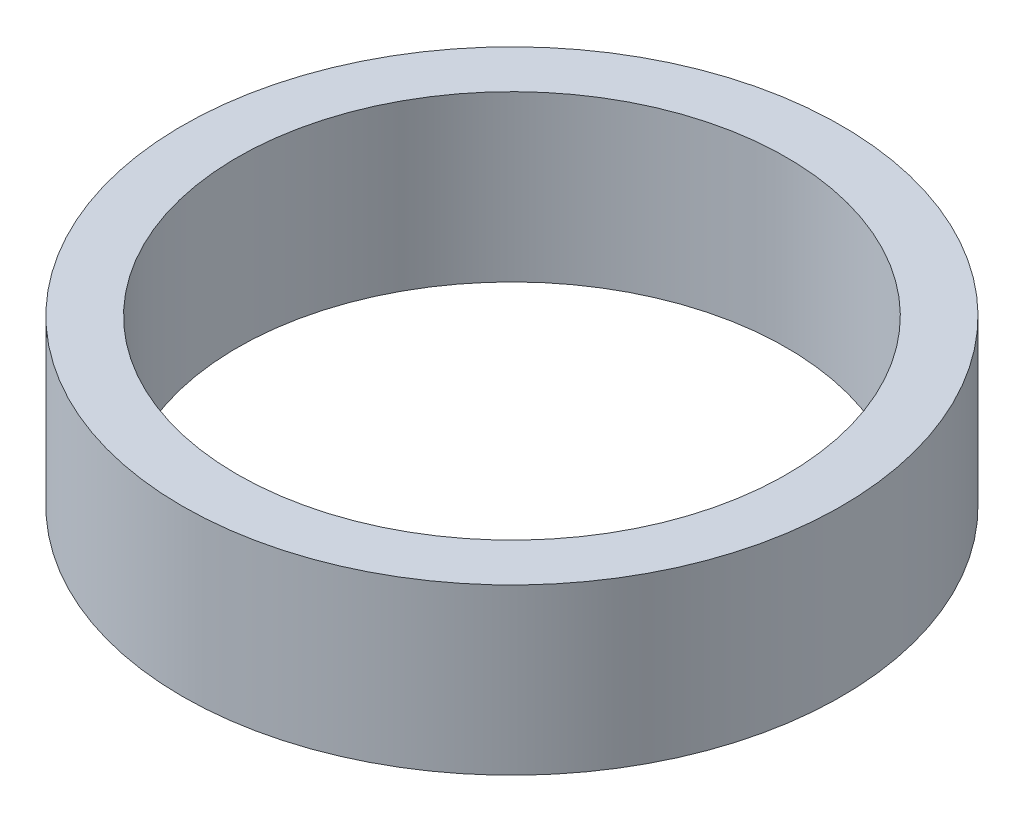
ISO-10303-21;
HEADER;
FILE_DESCRIPTION(('STEP AP214'),'2;1');
FILE_NAME('part.step','',(''),(''),'','','');
FILE_SCHEMA(('AUTOMOTIVE_DESIGN { 1 0 10303 214 1 1 1 1 }'));
ENDSEC;
DATA;
#1=APPLICATION_CONTEXT('core data for automotive mechanical design processes');
#2=APPLICATION_PROTOCOL_DEFINITION('international standard','automotive_design',2000,#1);
#3=PRODUCT_CONTEXT('',#1,'mechanical');
#4=PRODUCT('Part','Part','',(#3));
#5=PRODUCT_RELATED_PRODUCT_CATEGORY('part','',(#4));
#6=PRODUCT_DEFINITION_FORMATION('','',#4);
#7=PRODUCT_DEFINITION_CONTEXT('part definition',#1,'design');
#8=PRODUCT_DEFINITION('design','',#6,#7);
#9=PRODUCT_DEFINITION_SHAPE('','',#8);
#10=(LENGTH_UNIT() NAMED_UNIT(*) SI_UNIT(.MILLI.,.METRE.));
#11=(NAMED_UNIT(*) PLANE_ANGLE_UNIT() SI_UNIT($,.RADIAN.));
#12=(NAMED_UNIT(*) SI_UNIT($,.STERADIAN.) SOLID_ANGLE_UNIT());
#13=UNCERTAINTY_MEASURE_WITH_UNIT(LENGTH_MEASURE(1.E-05),#10,'distance_accuracy_value','');
#14=(GEOMETRIC_REPRESENTATION_CONTEXT(3) GLOBAL_UNCERTAINTY_ASSIGNED_CONTEXT((#13)) GLOBAL_UNIT_ASSIGNED_CONTEXT((#10,
#11,#12)) REPRESENTATION_CONTEXT('',''));
#15=CARTESIAN_POINT('',(0.,0.,0.));
#16=DIRECTION('',(0.,0.,1.));
#17=DIRECTION('',(1.,0.,0.));
#18=AXIS2_PLACEMENT_3D('',#15,#16,#17);
#19=CARTESIAN_POINT('',(0.,3.,0.));
#20=DIRECTION('',(0.,-1.,0.));
#21=DIRECTION('',(0.,0.,-1.));
#22=AXIS2_PLACEMENT_3D('',#19,#20,#21);
#23=CYLINDRICAL_SURFACE('',#22,6.);
#24=CARTESIAN_POINT('',(0.,3.,0.));
#25=DIRECTION('',(0.,1.,0.));
#26=DIRECTION('',(0.,0.,1.));
#27=AXIS2_PLACEMENT_3D('',#24,#25,#26);
#28=CIRCLE('',#27,6.);
#29=CARTESIAN_POINT('',(0.,3.,6.));
#30=VERTEX_POINT('',#29);
#31=EDGE_CURVE('E10',#30,#30,#28,.T.);
#32=ORIENTED_EDGE('',*,*,#31,.F.);
#33=EDGE_LOOP('',(#32));
#34=FACE_BOUND('',#33,.T.);
#35=CARTESIAN_POINT('',(0.,0.,0.));
#36=DIRECTION('',(0.,1.,0.));
#37=DIRECTION('',(0.,0.,1.));
#38=AXIS2_PLACEMENT_3D('',#35,#36,#37);
#39=CIRCLE('',#38,6.);
#40=CARTESIAN_POINT('',(0.,0.,6.));
#41=VERTEX_POINT('',#40);
#42=EDGE_CURVE('E45',#41,#41,#39,.T.);
#43=ORIENTED_EDGE('',*,*,#42,.T.);
#44=EDGE_LOOP('',(#43));
#45=FACE_BOUND('',#44,.T.);
#46=ADVANCED_FACE('F37',(#34,#45),#23,.T.);
#47=CARTESIAN_POINT('',(0.,3.,0.));
#48=DIRECTION('',(0.,1.,0.));
#49=DIRECTION('',(0.,0.,1.));
#50=AXIS2_PLACEMENT_3D('',#47,#48,#49);
#51=PLANE('',#50);
#52=CARTESIAN_POINT('',(0.,3.,0.));
#53=DIRECTION('',(0.,1.,0.));
#54=DIRECTION('',(0.,0.,1.));
#55=AXIS2_PLACEMENT_3D('',#52,#53,#54);
#56=CIRCLE('',#55,5.);
#57=CARTESIAN_POINT('',(0.,3.,5.));
#58=VERTEX_POINT('',#57);
#59=EDGE_CURVE('E52',#58,#58,#56,.T.);
#60=ORIENTED_EDGE('',*,*,#59,.F.);
#61=EDGE_LOOP('',(#60));
#62=FACE_BOUND('',#61,.T.);
#63=ORIENTED_EDGE('',*,*,#31,.T.);
#64=EDGE_LOOP('',(#63));
#65=FACE_BOUND('',#64,.T.);
#66=ADVANCED_FACE('F70',(#62,#65),#51,.T.);
#67=CARTESIAN_POINT('',(0.,0.,0.));
#68=DIRECTION('',(0.,1.,0.));
#69=DIRECTION('',(0.,0.,1.));
#70=AXIS2_PLACEMENT_3D('',#67,#68,#69);
#71=PLANE('',#70);
#72=CARTESIAN_POINT('',(0.,0.,0.));
#73=DIRECTION('',(0.,1.,0.));
#74=DIRECTION('',(0.,0.,1.));
#75=AXIS2_PLACEMENT_3D('',#72,#73,#74);
#76=CIRCLE('',#75,5.);
#77=CARTESIAN_POINT('',(0.,0.,5.));
#78=VERTEX_POINT('',#77);
#79=EDGE_CURVE('E40',#78,#78,#76,.T.);
#80=ORIENTED_EDGE('',*,*,#79,.T.);
#81=EDGE_LOOP('',(#80));
#82=FACE_BOUND('',#81,.T.);
#83=ORIENTED_EDGE('',*,*,#42,.F.);
#84=EDGE_LOOP('',(#83));
#85=FACE_BOUND('',#84,.T.);
#86=ADVANCED_FACE('F61',(#82,#85),#71,.F.);
#87=CARTESIAN_POINT('',(0.,-17.,0.));
#88=DIRECTION('',(0.,1.,0.));
#89=DIRECTION('',(0.,0.,1.));
#90=AXIS2_PLACEMENT_3D('',#87,#88,#89);
#91=CYLINDRICAL_SURFACE('',#90,5.);
#92=ORIENTED_EDGE('',*,*,#59,.T.);
#93=EDGE_LOOP('',(#92));
#94=FACE_BOUND('',#93,.T.);
#95=ORIENTED_EDGE('',*,*,#79,.F.);
#96=EDGE_LOOP('',(#95));
#97=FACE_BOUND('',#96,.T.);
#98=ADVANCED_FACE('F64',(#94,#97),#91,.F.);
#99=CLOSED_SHELL('',(#46,#66,#86,#98));
#100=MANIFOLD_SOLID_BREP('B2',#99);
#101=ADVANCED_BREP_SHAPE_REPRESENTATION('',(#18,#100),#14);
#102=SHAPE_DEFINITION_REPRESENTATION(#9,#101);
ENDSEC;
END-ISO-10303-21;
